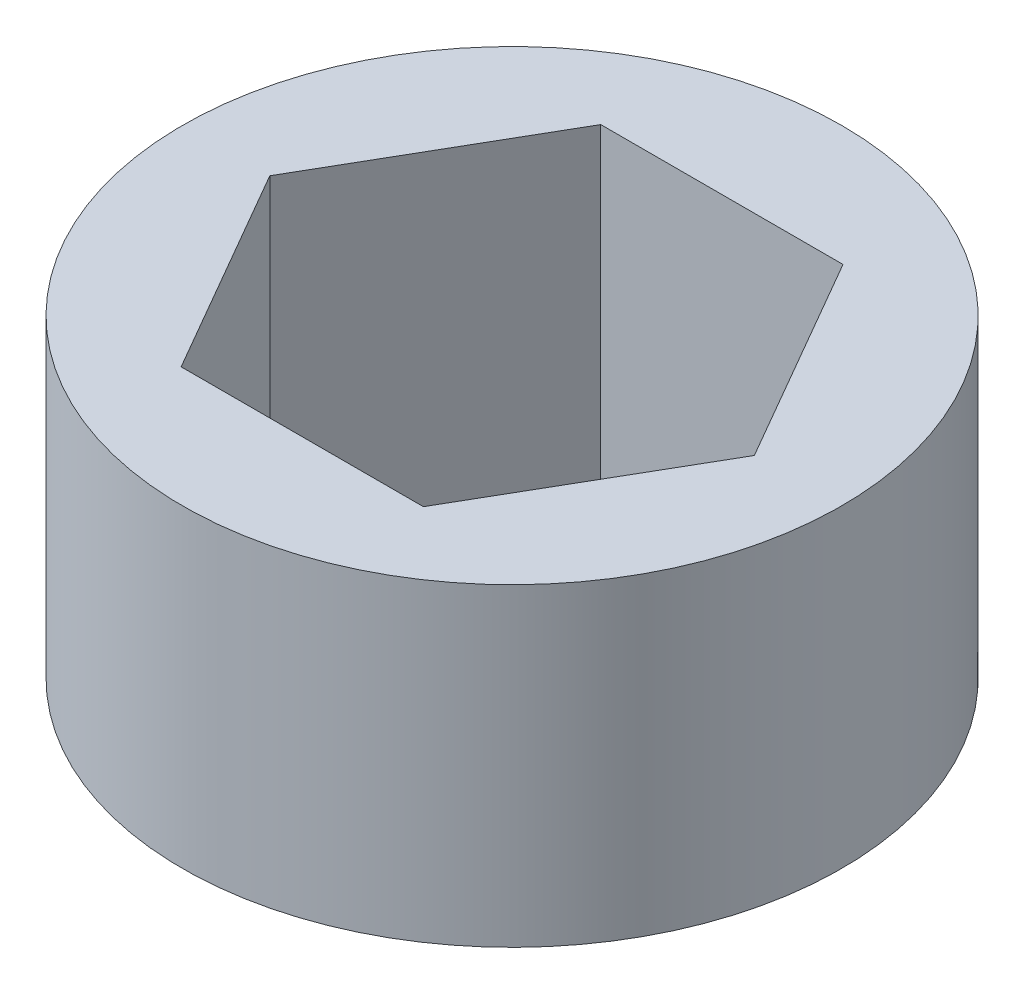
ISO-10303-21;
HEADER;
FILE_DESCRIPTION(('STEP AP214'),'2;1');
FILE_NAME('part.step','',(''),(''),'','','');
FILE_SCHEMA(('AUTOMOTIVE_DESIGN { 1 0 10303 214 1 1 1 1 }'));
ENDSEC;
DATA;
#1=APPLICATION_CONTEXT('core data for automotive mechanical design processes');
#2=APPLICATION_PROTOCOL_DEFINITION('international standard','automotive_design',2000,#1);
#3=PRODUCT_CONTEXT('',#1,'mechanical');
#4=PRODUCT('Part','Part','',(#3));
#5=PRODUCT_RELATED_PRODUCT_CATEGORY('part','',(#4));
#6=PRODUCT_DEFINITION_FORMATION('','',#4);
#7=PRODUCT_DEFINITION_CONTEXT('part definition',#1,'design');
#8=PRODUCT_DEFINITION('design','',#6,#7);
#9=PRODUCT_DEFINITION_SHAPE('','',#8);
#10=(LENGTH_UNIT() NAMED_UNIT(*) SI_UNIT(.MILLI.,.METRE.));
#11=(NAMED_UNIT(*) PLANE_ANGLE_UNIT() SI_UNIT($,.RADIAN.));
#12=(NAMED_UNIT(*) SI_UNIT($,.STERADIAN.) SOLID_ANGLE_UNIT());
#13=UNCERTAINTY_MEASURE_WITH_UNIT(LENGTH_MEASURE(1.E-05),#10,'distance_accuracy_value','');
#14=(GEOMETRIC_REPRESENTATION_CONTEXT(3) GLOBAL_UNCERTAINTY_ASSIGNED_CONTEXT((#13)) GLOBAL_UNIT_ASSIGNED_CONTEXT((#10,
#11,#12)) REPRESENTATION_CONTEXT('',''));
#15=CARTESIAN_POINT('',(0.,0.,0.));
#16=DIRECTION('',(0.,0.,1.));
#17=DIRECTION('',(1.,0.,0.));
#18=AXIS2_PLACEMENT_3D('',#15,#16,#17);
#19=CARTESIAN_POINT('',(0.,9.525,0.));
#20=DIRECTION('',(0.,1.,0.));
#21=DIRECTION('',(0.,0.,1.));
#22=AXIS2_PLACEMENT_3D('',#19,#20,#21);
#23=PLANE('',#22);
#24=CARTESIAN_POINT('',(0.,9.525,0.));
#25=DIRECTION('',(0.,1.,0.));
#26=DIRECTION('',(0.,0.,1.));
#27=AXIS2_PLACEMENT_3D('',#24,#25,#26);
#28=CIRCLE('',#27,9.9949);
#29=CARTESIAN_POINT('',(0.,9.525,-9.9949));
#30=VERTEX_POINT('',#29);
#31=EDGE_CURVE('E11',#30,#30,#28,.T.);
#32=ORIENTED_EDGE('',*,*,#31,.T.);
#33=EDGE_LOOP('',(#32));
#34=FACE_BOUND('',#33,.T.);
#35=DIRECTION('',(-0.5,0.,-0.866025403784438));
#36=VECTOR('',#35,1.);
#37=CARTESIAN_POINT('',(7.34701311554567,9.525,0.));
#38=LINE('',#37,#36);
#39=CARTESIAN_POINT('',(7.34701311554567,9.525,0.));
#40=VERTEX_POINT('',#39);
#41=CARTESIAN_POINT('',(3.67350655777283,9.525,-6.3627));
#42=VERTEX_POINT('',#41);
#43=EDGE_CURVE('E96',#40,#42,#38,.T.);
#44=ORIENTED_EDGE('',*,*,#43,.F.);
#45=DIRECTION('',(0.5,0.,-0.866025403784439));
#46=VECTOR('',#45,1.);
#47=CARTESIAN_POINT('',(3.67350655777284,9.525,6.3627));
#48=LINE('',#47,#46);
#49=CARTESIAN_POINT('',(3.67350655777284,9.525,6.3627));
#50=VERTEX_POINT('',#49);
#51=EDGE_CURVE('E88',#50,#40,#48,.T.);
#52=ORIENTED_EDGE('',*,*,#51,.F.);
#53=DIRECTION('',(1.,0.,0.));
#54=VECTOR('',#53,1.);
#55=CARTESIAN_POINT('',(-3.67350655777283,9.525,6.3627));
#56=LINE('',#55,#54);
#57=CARTESIAN_POINT('',(-3.67350655777283,9.525,6.3627));
#58=VERTEX_POINT('',#57);
#59=EDGE_CURVE('E116',#58,#50,#56,.T.);
#60=ORIENTED_EDGE('',*,*,#59,.F.);
#61=DIRECTION('',(0.5,0.,0.866025403784438));
#62=VECTOR('',#61,1.);
#63=CARTESIAN_POINT('',(-7.34701311554566,9.525,0.));
#64=LINE('',#63,#62);
#65=CARTESIAN_POINT('',(-7.34701311554566,9.525,0.));
#66=VERTEX_POINT('',#65);
#67=EDGE_CURVE('E114',#66,#58,#64,.T.);
#68=ORIENTED_EDGE('',*,*,#67,.F.);
#69=DIRECTION('',(-0.5,0.,0.866025403784439));
#70=VECTOR('',#69,1.);
#71=CARTESIAN_POINT('',(-3.67350655777283,9.525,-6.3627));
#72=LINE('',#71,#70);
#73=CARTESIAN_POINT('',(-3.67350655777283,9.525,-6.3627));
#74=VERTEX_POINT('',#73);
#75=EDGE_CURVE('E110',#74,#66,#72,.T.);
#76=ORIENTED_EDGE('',*,*,#75,.F.);
#77=DIRECTION('',(-1.,0.,0.));
#78=VECTOR('',#77,1.);
#79=CARTESIAN_POINT('',(3.67350655777283,9.525,-6.3627));
#80=LINE('',#79,#78);
#81=EDGE_CURVE('E108',#42,#74,#80,.T.);
#82=ORIENTED_EDGE('',*,*,#81,.F.);
#83=EDGE_LOOP('',(#44,#52,#60,#68,#76,#82));
#84=FACE_BOUND('',#83,.T.);
#85=ADVANCED_FACE('F35',(#34,#84),#23,.T.);
#86=CARTESIAN_POINT('',(0.,0.,0.));
#87=DIRECTION('',(0.,1.,0.));
#88=DIRECTION('',(0.,0.,1.));
#89=AXIS2_PLACEMENT_3D('',#86,#87,#88);
#90=PLANE('',#89);
#91=CARTESIAN_POINT('',(0.,0.,0.));
#92=DIRECTION('',(0.,1.,0.));
#93=DIRECTION('',(0.,0.,1.));
#94=AXIS2_PLACEMENT_3D('',#91,#92,#93);
#95=CIRCLE('',#94,9.9949);
#96=CARTESIAN_POINT('',(0.,0.,-9.9949));
#97=VERTEX_POINT('',#96);
#98=EDGE_CURVE('E39',#97,#97,#95,.T.);
#99=ORIENTED_EDGE('',*,*,#98,.F.);
#100=EDGE_LOOP('',(#99));
#101=FACE_BOUND('',#100,.T.);
#102=DIRECTION('',(0.5,0.,-0.866025403784439));
#103=VECTOR('',#102,1.);
#104=CARTESIAN_POINT('',(3.67350655777284,0.,6.3627));
#105=LINE('',#104,#103);
#106=CARTESIAN_POINT('',(3.67350655777284,0.,6.3627));
#107=VERTEX_POINT('',#106);
#108=CARTESIAN_POINT('',(7.34701311554567,0.,0.));
#109=VERTEX_POINT('',#108);
#110=EDGE_CURVE('E58',#107,#109,#105,.T.);
#111=ORIENTED_EDGE('',*,*,#110,.T.);
#112=DIRECTION('',(-0.5,0.,-0.866025403784438));
#113=VECTOR('',#112,1.);
#114=CARTESIAN_POINT('',(7.34701311554567,0.,0.));
#115=LINE('',#114,#113);
#116=CARTESIAN_POINT('',(3.67350655777283,0.,-6.3627));
#117=VERTEX_POINT('',#116);
#118=EDGE_CURVE('E103',#109,#117,#115,.T.);
#119=ORIENTED_EDGE('',*,*,#118,.T.);
#120=DIRECTION('',(-1.,0.,0.));
#121=VECTOR('',#120,1.);
#122=CARTESIAN_POINT('',(3.67350655777283,0.,-6.3627));
#123=LINE('',#122,#121);
#124=CARTESIAN_POINT('',(-3.67350655777283,0.,-6.3627));
#125=VERTEX_POINT('',#124);
#126=EDGE_CURVE('E120',#117,#125,#123,.T.);
#127=ORIENTED_EDGE('',*,*,#126,.T.);
#128=DIRECTION('',(-0.5,0.,0.866025403784439));
#129=VECTOR('',#128,1.);
#130=CARTESIAN_POINT('',(-3.67350655777283,0.,-6.3627));
#131=LINE('',#130,#129);
#132=CARTESIAN_POINT('',(-7.34701311554566,0.,0.));
#133=VERTEX_POINT('',#132);
#134=EDGE_CURVE('E123',#125,#133,#131,.T.);
#135=ORIENTED_EDGE('',*,*,#134,.T.);
#136=DIRECTION('',(0.5,0.,0.866025403784438));
#137=VECTOR('',#136,1.);
#138=CARTESIAN_POINT('',(-7.34701311554566,0.,0.));
#139=LINE('',#138,#137);
#140=CARTESIAN_POINT('',(-3.67350655777283,0.,6.3627));
#141=VERTEX_POINT('',#140);
#142=EDGE_CURVE('E126',#133,#141,#139,.T.);
#143=ORIENTED_EDGE('',*,*,#142,.T.);
#144=DIRECTION('',(1.,0.,0.));
#145=VECTOR('',#144,1.);
#146=CARTESIAN_POINT('',(-3.67350655777283,0.,6.3627));
#147=LINE('',#146,#145);
#148=EDGE_CURVE('E97',#141,#107,#147,.T.);
#149=ORIENTED_EDGE('',*,*,#148,.T.);
#150=EDGE_LOOP('',(#111,#119,#127,#135,#143,#149));
#151=FACE_BOUND('',#150,.T.);
#152=ADVANCED_FACE('F143',(#101,#151),#90,.F.);
#153=CARTESIAN_POINT('',(0.,9.525,0.));
#154=DIRECTION('',(0.,-1.,0.));
#155=DIRECTION('',(0.,0.,-1.));
#156=AXIS2_PLACEMENT_3D('',#153,#154,#155);
#157=CYLINDRICAL_SURFACE('',#156,9.9949);
#158=CARTESIAN_POINT('',(0.,9.525,-9.9949));
#159=CARTESIAN_POINT('',(0.,9.42578125,-9.9949));
#160=CARTESIAN_POINT('',(0.,9.3265625,-9.9949));
#161=CARTESIAN_POINT('',(0.,9.128125,-9.9949));
#162=CARTESIAN_POINT('',(0.,9.02890625,-9.9949));
#163=CARTESIAN_POINT('',(0.,8.83046875,-9.9949));
#164=CARTESIAN_POINT('',(0.,8.73125,-9.9949));
#165=CARTESIAN_POINT('',(0.,8.5328125,-9.9949));
#166=CARTESIAN_POINT('',(0.,8.43359375,-9.9949));
#167=CARTESIAN_POINT('',(0.,8.23515625,-9.9949));
#168=CARTESIAN_POINT('',(0.,8.1359375,-9.9949));
#169=CARTESIAN_POINT('',(0.,7.9375,-9.9949));
#170=CARTESIAN_POINT('',(0.,7.83828125,-9.9949));
#171=CARTESIAN_POINT('',(0.,7.63984375,-9.9949));
#172=CARTESIAN_POINT('',(0.,7.540625,-9.9949));
#173=CARTESIAN_POINT('',(0.,7.3421875,-9.9949));
#174=CARTESIAN_POINT('',(0.,7.24296875,-9.9949));
#175=CARTESIAN_POINT('',(0.,7.04453125,-9.9949));
#176=CARTESIAN_POINT('',(0.,6.9453125,-9.9949));
#177=CARTESIAN_POINT('',(0.,6.746875,-9.9949));
#178=CARTESIAN_POINT('',(0.,6.64765625,-9.9949));
#179=CARTESIAN_POINT('',(0.,6.44921875,-9.9949));
#180=CARTESIAN_POINT('',(0.,6.35,-9.9949));
#181=CARTESIAN_POINT('',(0.,6.1515625,-9.9949));
#182=CARTESIAN_POINT('',(0.,6.05234375,-9.9949));
#183=CARTESIAN_POINT('',(0.,5.85390625,-9.9949));
#184=CARTESIAN_POINT('',(0.,5.7546875,-9.9949));
#185=CARTESIAN_POINT('',(0.,5.55625,-9.9949));
#186=CARTESIAN_POINT('',(0.,5.45703125,-9.9949));
#187=CARTESIAN_POINT('',(0.,5.25859375,-9.9949));
#188=CARTESIAN_POINT('',(0.,5.159375,-9.9949));
#189=CARTESIAN_POINT('',(0.,4.9609375,-9.9949));
#190=CARTESIAN_POINT('',(0.,4.86171875,-9.9949));
#191=CARTESIAN_POINT('',(0.,4.66328125,-9.9949));
#192=CARTESIAN_POINT('',(0.,4.5640625,-9.9949));
#193=CARTESIAN_POINT('',(0.,4.365625,-9.9949));
#194=CARTESIAN_POINT('',(0.,4.26640625,-9.9949));
#195=CARTESIAN_POINT('',(0.,4.06796875,-9.9949));
#196=CARTESIAN_POINT('',(0.,3.96875,-9.9949));
#197=CARTESIAN_POINT('',(0.,3.7703125,-9.9949));
#198=CARTESIAN_POINT('',(0.,3.67109375,-9.9949));
#199=CARTESIAN_POINT('',(0.,3.47265625,-9.9949));
#200=CARTESIAN_POINT('',(0.,3.3734375,-9.9949));
#201=CARTESIAN_POINT('',(0.,3.175,-9.9949));
#202=CARTESIAN_POINT('',(0.,3.07578125,-9.9949));
#203=CARTESIAN_POINT('',(0.,2.87734375,-9.9949));
#204=CARTESIAN_POINT('',(0.,2.778125,-9.9949));
#205=CARTESIAN_POINT('',(0.,2.5796875,-9.9949));
#206=CARTESIAN_POINT('',(0.,2.48046875,-9.9949));
#207=CARTESIAN_POINT('',(0.,2.28203125,-9.9949));
#208=CARTESIAN_POINT('',(0.,2.1828125,-9.9949));
#209=CARTESIAN_POINT('',(0.,1.984375,-9.9949));
#210=CARTESIAN_POINT('',(0.,1.88515625,-9.9949));
#211=CARTESIAN_POINT('',(0.,1.68671875,-9.9949));
#212=CARTESIAN_POINT('',(0.,1.5875,-9.9949));
#213=CARTESIAN_POINT('',(0.,1.3890625,-9.9949));
#214=CARTESIAN_POINT('',(0.,1.28984375,-9.9949));
#215=CARTESIAN_POINT('',(0.,1.09140625,-9.9949));
#216=CARTESIAN_POINT('',(0.,0.992187500000001,-9.9949));
#217=CARTESIAN_POINT('',(0.,0.793750000000001,-9.9949));
#218=CARTESIAN_POINT('',(0.,0.69453125,-9.9949));
#219=CARTESIAN_POINT('',(0.,0.49609375,-9.9949));
#220=CARTESIAN_POINT('',(0.,0.396875,-9.9949));
#221=CARTESIAN_POINT('',(0.,0.1984375,-9.9949));
#222=CARTESIAN_POINT('',(0.,0.0992187500000001,-9.9949));
#223=CARTESIAN_POINT('',(0.,0.,-9.9949));
#224=B_SPLINE_CURVE_WITH_KNOTS('',3,(#158,#159,#160,#161,#162,#163,#164,#165,#166,#167,#168,
#169,#170,#171,#172,#173,#174,#175,#176,#177,#178,#179,#180,#181,#182,#183,#184,#185,#186,#187,
#188,#189,#190,#191,#192,#193,#194,#195,#196,#197,#198,#199,#200,#201,#202,#203,#204,#205,#206,
#207,#208,#209,#210,#211,#212,#213,#214,#215,#216,#217,#218,#219,#220,#221,#222,#223),
.UNSPECIFIED.,.F.,.F.,(4,2,2,2,2,2,2,2,2,2,2,2,2,2,2,2,2,2,2,2,2,2,2,2,2,2,2,2,2,2,2,2,4),(0.,
0.29765625,0.5953125,0.892968750000001,1.190625,1.48828125,1.7859375,2.08359375,2.38125,
2.67890625,2.9765625,3.27421875,3.571875,3.86953125,4.1671875,4.46484375,4.7625,5.06015625,
5.3578125,5.65546875,5.953125,6.25078125,6.5484375,6.84609375,7.14375,7.44140625,7.7390625,
8.03671875,8.334375,8.63203125,8.9296875,9.22734375,9.525),.UNSPECIFIED.);
#225=EDGE_CURVE('BSEAM37',#30,#97,#224,.T.);
#226=ORIENTED_EDGE('',*,*,#31,.F.);
#227=ORIENTED_EDGE('',*,*,#98,.T.);
#228=ORIENTED_EDGE('',*,*,#225,.T.);
#229=ORIENTED_EDGE('',*,*,#225,.F.);
#230=EDGE_LOOP('',(#226,#228,#227,#229));
#231=FACE_BOUND('',#230,.T.);
#232=ADVANCED_FACE('F37',(#231),#157,.T.);
#233=CARTESIAN_POINT('',(3.67350655777284,9.525,6.3627));
#234=DIRECTION('',(-0.866025403784439,0.,-0.5));
#235=DIRECTION('',(-0.5,0.,0.866025403784439));
#236=AXIS2_PLACEMENT_3D('',#233,#234,#235);
#237=PLANE('',#236);
#238=ORIENTED_EDGE('',*,*,#110,.F.);
#239=DIRECTION('',(0.,-1.,0.));
#240=VECTOR('',#239,1.);
#241=CARTESIAN_POINT('',(3.67350655777284,9.525,6.3627));
#242=LINE('',#241,#240);
#243=EDGE_CURVE('E92',#50,#107,#242,.T.);
#244=ORIENTED_EDGE('',*,*,#243,.F.);
#245=ORIENTED_EDGE('',*,*,#51,.T.);
#246=DIRECTION('',(0.,-1.,0.));
#247=VECTOR('',#246,1.);
#248=CARTESIAN_POINT('',(7.34701311554567,9.525,0.));
#249=LINE('',#248,#247);
#250=EDGE_CURVE('E91',#40,#109,#249,.T.);
#251=ORIENTED_EDGE('',*,*,#250,.T.);
#252=EDGE_LOOP('',(#238,#244,#245,#251));
#253=FACE_BOUND('',#252,.T.);
#254=ADVANCED_FACE('F90',(#253),#237,.T.);
#255=CARTESIAN_POINT('',(7.34701311554567,9.525,0.));
#256=DIRECTION('',(-0.866025403784438,0.,0.5));
#257=DIRECTION('',(0.5,0.,0.866025403784438));
#258=AXIS2_PLACEMENT_3D('',#255,#256,#257);
#259=PLANE('',#258);
#260=ORIENTED_EDGE('',*,*,#118,.F.);
#261=ORIENTED_EDGE('',*,*,#250,.F.);
#262=ORIENTED_EDGE('',*,*,#43,.T.);
#263=DIRECTION('',(0.,-1.,0.));
#264=VECTOR('',#263,1.);
#265=CARTESIAN_POINT('',(3.67350655777283,9.525,-6.3627));
#266=LINE('',#265,#264);
#267=EDGE_CURVE('E104',#42,#117,#266,.T.);
#268=ORIENTED_EDGE('',*,*,#267,.T.);
#269=EDGE_LOOP('',(#260,#261,#262,#268));
#270=FACE_BOUND('',#269,.T.);
#271=ADVANCED_FACE('F100',(#270),#259,.T.);
#272=CARTESIAN_POINT('',(3.67350655777283,9.525,-6.3627));
#273=DIRECTION('',(0.,0.,1.));
#274=DIRECTION('',(1.,0.,0.));
#275=AXIS2_PLACEMENT_3D('',#272,#273,#274);
#276=PLANE('',#275);
#277=ORIENTED_EDGE('',*,*,#126,.F.);
#278=ORIENTED_EDGE('',*,*,#267,.F.);
#279=ORIENTED_EDGE('',*,*,#81,.T.);
#280=DIRECTION('',(0.,-1.,0.));
#281=VECTOR('',#280,1.);
#282=CARTESIAN_POINT('',(-3.67350655777283,9.525,-6.3627));
#283=LINE('',#282,#281);
#284=EDGE_CURVE('E135',#74,#125,#283,.T.);
#285=ORIENTED_EDGE('',*,*,#284,.T.);
#286=EDGE_LOOP('',(#277,#278,#279,#285));
#287=FACE_BOUND('',#286,.T.);
#288=ADVANCED_FACE('F139',(#287),#276,.T.);
#289=CARTESIAN_POINT('',(-3.67350655777283,9.525,-6.3627));
#290=DIRECTION('',(0.866025403784439,0.,0.5));
#291=DIRECTION('',(0.5,0.,-0.866025403784439));
#292=AXIS2_PLACEMENT_3D('',#289,#290,#291);
#293=PLANE('',#292);
#294=ORIENTED_EDGE('',*,*,#134,.F.);
#295=ORIENTED_EDGE('',*,*,#284,.F.);
#296=ORIENTED_EDGE('',*,*,#75,.T.);
#297=DIRECTION('',(0.,-1.,0.));
#298=VECTOR('',#297,1.);
#299=CARTESIAN_POINT('',(-7.34701311554566,9.525,0.));
#300=LINE('',#299,#298);
#301=EDGE_CURVE('E133',#66,#133,#300,.T.);
#302=ORIENTED_EDGE('',*,*,#301,.T.);
#303=EDGE_LOOP('',(#294,#295,#296,#302));
#304=FACE_BOUND('',#303,.T.);
#305=ADVANCED_FACE('F151',(#304),#293,.T.);
#306=CARTESIAN_POINT('',(-7.34701311554566,9.525,0.));
#307=DIRECTION('',(0.866025403784439,0.,-0.5));
#308=DIRECTION('',(-0.5,0.,-0.866025403784438));
#309=AXIS2_PLACEMENT_3D('',#306,#307,#308);
#310=PLANE('',#309);
#311=ORIENTED_EDGE('',*,*,#142,.F.);
#312=ORIENTED_EDGE('',*,*,#301,.F.);
#313=ORIENTED_EDGE('',*,*,#67,.T.);
#314=DIRECTION('',(0.,-1.,0.));
#315=VECTOR('',#314,1.);
#316=CARTESIAN_POINT('',(-3.67350655777283,9.525,6.3627));
#317=LINE('',#316,#315);
#318=EDGE_CURVE('E50',#58,#141,#317,.T.);
#319=ORIENTED_EDGE('',*,*,#318,.T.);
#320=EDGE_LOOP('',(#311,#312,#313,#319));
#321=FACE_BOUND('',#320,.T.);
#322=ADVANCED_FACE('F149',(#321),#310,.T.);
#323=CARTESIAN_POINT('',(-3.67350655777283,9.525,6.3627));
#324=DIRECTION('',(0.,0.,-1.));
#325=DIRECTION('',(-1.,0.,0.));
#326=AXIS2_PLACEMENT_3D('',#323,#324,#325);
#327=PLANE('',#326);
#328=ORIENTED_EDGE('',*,*,#148,.F.);
#329=ORIENTED_EDGE('',*,*,#318,.F.);
#330=ORIENTED_EDGE('',*,*,#59,.T.);
#331=ORIENTED_EDGE('',*,*,#243,.T.);
#332=EDGE_LOOP('',(#328,#329,#330,#331));
#333=FACE_BOUND('',#332,.T.);
#334=ADVANCED_FACE('F145',(#333),#327,.T.);
#335=CLOSED_SHELL('',(#85,#152,#232,#254,#271,#288,#305,#322,#334));
#336=MANIFOLD_SOLID_BREP('B2',#335);
#337=ADVANCED_BREP_SHAPE_REPRESENTATION('',(#18,#336),#14);
#338=SHAPE_DEFINITION_REPRESENTATION(#9,#337);
ENDSEC;
END-ISO-10303-21;
